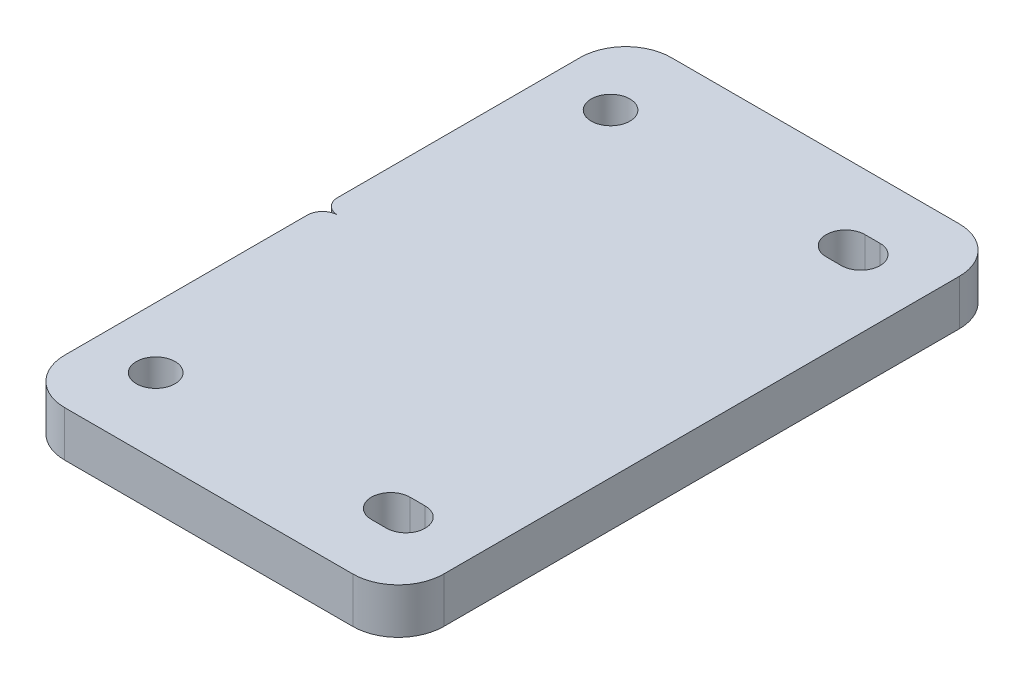
ISO-10303-21;
HEADER;
FILE_DESCRIPTION(('STEP AP214'),'2;1');
FILE_NAME('part.step','',(''),(''),'','','');
FILE_SCHEMA(('AUTOMOTIVE_DESIGN { 1 0 10303 214 1 1 1 1 }'));
ENDSEC;
DATA;
#1=APPLICATION_CONTEXT('core data for automotive mechanical design processes');
#2=APPLICATION_PROTOCOL_DEFINITION('international standard','automotive_design',2000,#1);
#3=PRODUCT_CONTEXT('',#1,'mechanical');
#4=PRODUCT('Part','Part','',(#3));
#5=PRODUCT_RELATED_PRODUCT_CATEGORY('part','',(#4));
#6=PRODUCT_DEFINITION_FORMATION('','',#4);
#7=PRODUCT_DEFINITION_CONTEXT('part definition',#1,'design');
#8=PRODUCT_DEFINITION('design','',#6,#7);
#9=PRODUCT_DEFINITION_SHAPE('','',#8);
#10=(LENGTH_UNIT() NAMED_UNIT(*) SI_UNIT(.MILLI.,.METRE.));
#11=(NAMED_UNIT(*) PLANE_ANGLE_UNIT() SI_UNIT($,.RADIAN.));
#12=(NAMED_UNIT(*) SI_UNIT($,.STERADIAN.) SOLID_ANGLE_UNIT());
#13=UNCERTAINTY_MEASURE_WITH_UNIT(LENGTH_MEASURE(1.E-05),#10,'distance_accuracy_value','');
#14=(GEOMETRIC_REPRESENTATION_CONTEXT(3) GLOBAL_UNCERTAINTY_ASSIGNED_CONTEXT((#13)) GLOBAL_UNIT_ASSIGNED_CONTEXT((#10,
#11,#12)) REPRESENTATION_CONTEXT('',''));
#15=CARTESIAN_POINT('',(0.,0.,0.));
#16=DIRECTION('',(0.,0.,1.));
#17=DIRECTION('',(1.,0.,0.));
#18=AXIS2_PLACEMENT_3D('',#15,#16,#17);
#19=CARTESIAN_POINT('',(-25.,6.,34.));
#20=DIRECTION('',(1.,0.,0.));
#21=DIRECTION('',(0.,0.,-1.));
#22=AXIS2_PLACEMENT_3D('',#19,#20,#21);
#23=PLANE('',#22);
#24=DIRECTION('',(0.,-1.,0.));
#25=VECTOR('',#24,1.);
#26=CARTESIAN_POINT('',(-25.,6.,2.));
#27=LINE('',#26,#25);
#28=CARTESIAN_POINT('',(-25.,6.,2.));
#29=VERTEX_POINT('',#28);
#30=CARTESIAN_POINT('',(-25.,0.,2.));
#31=VERTEX_POINT('',#30);
#32=EDGE_CURVE('E165',#29,#31,#27,.T.);
#33=ORIENTED_EDGE('',*,*,#32,.T.);
#34=DIRECTION('',(0.,0.,1.));
#35=VECTOR('',#34,1.);
#36=CARTESIAN_POINT('',(-25.,0.,34.));
#37=LINE('',#36,#35);
#38=CARTESIAN_POINT('',(-25.,0.,34.));
#39=VERTEX_POINT('',#38);
#40=EDGE_CURVE('E211',#31,#39,#37,.T.);
#41=ORIENTED_EDGE('',*,*,#40,.T.);
#42=DIRECTION('',(0.,-1.,0.));
#43=VECTOR('',#42,1.);
#44=CARTESIAN_POINT('',(-25.,6.,34.));
#45=LINE('',#44,#43);
#46=CARTESIAN_POINT('',(-25.,6.,34.));
#47=VERTEX_POINT('',#46);
#48=EDGE_CURVE('E185',#47,#39,#45,.T.);
#49=ORIENTED_EDGE('',*,*,#48,.F.);
#50=DIRECTION('',(0.,0.,1.));
#51=VECTOR('',#50,1.);
#52=CARTESIAN_POINT('',(-25.,6.,34.));
#53=LINE('',#52,#51);
#54=EDGE_CURVE('E179',#29,#47,#53,.T.);
#55=ORIENTED_EDGE('',*,*,#54,.F.);
#56=EDGE_LOOP('',(#33,#41,#49,#55));
#57=FACE_BOUND('',#56,.T.);
#58=ADVANCED_FACE('F33',(#57),#23,.F.);
#59=CARTESIAN_POINT('',(19.,6.,-34.));
#60=DIRECTION('',(0.,-1.,0.));
#61=DIRECTION('',(0.,0.,-1.));
#62=AXIS2_PLACEMENT_3D('',#59,#60,#61);
#63=CYLINDRICAL_SURFACE('',#62,6.);
#64=CARTESIAN_POINT('',(19.,0.,-34.));
#65=DIRECTION('',(0.,1.,0.));
#66=DIRECTION('',(0.,0.,-1.));
#67=AXIS2_PLACEMENT_3D('',#64,#65,#66);
#68=CIRCLE('',#67,6.);
#69=CARTESIAN_POINT('',(25.,0.,-34.));
#70=VERTEX_POINT('',#69);
#71=CARTESIAN_POINT('',(19.,0.,-40.));
#72=VERTEX_POINT('',#71);
#73=EDGE_CURVE('E203',#70,#72,#68,.T.);
#74=ORIENTED_EDGE('',*,*,#73,.T.);
#75=DIRECTION('',(0.,-1.,0.));
#76=VECTOR('',#75,1.);
#77=CARTESIAN_POINT('',(19.,6.,-40.));
#78=LINE('',#77,#76);
#79=CARTESIAN_POINT('',(19.,6.,-40.));
#80=VERTEX_POINT('',#79);
#81=EDGE_CURVE('E11',#80,#72,#78,.T.);
#82=ORIENTED_EDGE('',*,*,#81,.F.);
#83=CARTESIAN_POINT('',(19.,6.,-34.));
#84=DIRECTION('',(0.,1.,0.));
#85=DIRECTION('',(0.,0.,-1.));
#86=AXIS2_PLACEMENT_3D('',#83,#84,#85);
#87=CIRCLE('',#86,6.);
#88=CARTESIAN_POINT('',(25.,6.,-34.));
#89=VERTEX_POINT('',#88);
#90=EDGE_CURVE('E223',#89,#80,#87,.T.);
#91=ORIENTED_EDGE('',*,*,#90,.F.);
#92=DIRECTION('',(0.,-1.,0.));
#93=VECTOR('',#92,1.);
#94=CARTESIAN_POINT('',(25.,6.,-34.));
#95=LINE('',#94,#93);
#96=EDGE_CURVE('E202',#89,#70,#95,.T.);
#97=ORIENTED_EDGE('',*,*,#96,.T.);
#98=EDGE_LOOP('',(#74,#82,#91,#97));
#99=FACE_BOUND('',#98,.T.);
#100=ADVANCED_FACE('F35',(#99),#63,.T.);
#101=CARTESIAN_POINT('',(-19.,6.,-40.));
#102=DIRECTION('',(0.,0.,1.));
#103=DIRECTION('',(1.,0.,0.));
#104=AXIS2_PLACEMENT_3D('',#101,#102,#103);
#105=PLANE('',#104);
#106=DIRECTION('',(-1.,0.,0.));
#107=VECTOR('',#106,1.);
#108=CARTESIAN_POINT('',(-19.,0.,-40.));
#109=LINE('',#108,#107);
#110=CARTESIAN_POINT('',(-19.,0.,-40.));
#111=VERTEX_POINT('',#110);
#112=EDGE_CURVE('E206',#72,#111,#109,.T.);
#113=ORIENTED_EDGE('',*,*,#112,.T.);
#114=DIRECTION('',(0.,-1.,0.));
#115=VECTOR('',#114,1.);
#116=CARTESIAN_POINT('',(-19.,6.,-40.));
#117=LINE('',#116,#115);
#118=CARTESIAN_POINT('',(-19.,6.,-40.));
#119=VERTEX_POINT('',#118);
#120=EDGE_CURVE('E41',#119,#111,#117,.T.);
#121=ORIENTED_EDGE('',*,*,#120,.F.);
#122=DIRECTION('',(-1.,0.,0.));
#123=VECTOR('',#122,1.);
#124=CARTESIAN_POINT('',(-19.,6.,-40.));
#125=LINE('',#124,#123);
#126=EDGE_CURVE('E191',#80,#119,#125,.T.);
#127=ORIENTED_EDGE('',*,*,#126,.F.);
#128=ORIENTED_EDGE('',*,*,#81,.T.);
#129=EDGE_LOOP('',(#113,#121,#127,#128));
#130=FACE_BOUND('',#129,.T.);
#131=ADVANCED_FACE('F358',(#130),#105,.F.);
#132=CARTESIAN_POINT('',(-19.,6.,-34.));
#133=DIRECTION('',(0.,-1.,0.));
#134=DIRECTION('',(0.,0.,-1.));
#135=AXIS2_PLACEMENT_3D('',#132,#133,#134);
#136=CYLINDRICAL_SURFACE('',#135,6.);
#137=CARTESIAN_POINT('',(-19.,0.,-34.));
#138=DIRECTION('',(0.,1.,0.));
#139=DIRECTION('',(0.,0.,-1.));
#140=AXIS2_PLACEMENT_3D('',#137,#138,#139);
#141=CIRCLE('',#140,6.);
#142=CARTESIAN_POINT('',(-25.,0.,-34.));
#143=VERTEX_POINT('',#142);
#144=EDGE_CURVE('E209',#111,#143,#141,.T.);
#145=ORIENTED_EDGE('',*,*,#144,.T.);
#146=DIRECTION('',(0.,-1.,0.));
#147=VECTOR('',#146,1.);
#148=CARTESIAN_POINT('',(-25.,6.,-34.));
#149=LINE('',#148,#147);
#150=CARTESIAN_POINT('',(-25.,6.,-34.));
#151=VERTEX_POINT('',#150);
#152=EDGE_CURVE('E236',#151,#143,#149,.T.);
#153=ORIENTED_EDGE('',*,*,#152,.F.);
#154=CARTESIAN_POINT('',(-19.,6.,-34.));
#155=DIRECTION('',(0.,1.,0.));
#156=DIRECTION('',(0.,0.,-1.));
#157=AXIS2_PLACEMENT_3D('',#154,#155,#156);
#158=CIRCLE('',#157,6.);
#159=EDGE_CURVE('E188',#119,#151,#158,.T.);
#160=ORIENTED_EDGE('',*,*,#159,.F.);
#161=ORIENTED_EDGE('',*,*,#120,.T.);
#162=EDGE_LOOP('',(#145,#153,#160,#161));
#163=FACE_BOUND('',#162,.T.);
#164=ADVANCED_FACE('F243',(#163),#136,.T.);
#165=CARTESIAN_POINT('',(-25.,0.,-1.99999999999999));
#166=VERTEX_POINT('',#165);
#167=EDGE_CURVE('E212',#143,#166,#37,.T.);
#168=ORIENTED_EDGE('',*,*,#167,.T.);
#169=DIRECTION('',(0.,-1.,0.));
#170=VECTOR('',#169,1.);
#171=CARTESIAN_POINT('',(-25.,6.,-2.));
#172=LINE('',#171,#170);
#173=CARTESIAN_POINT('',(-25.,6.,-2.));
#174=VERTEX_POINT('',#173);
#175=EDGE_CURVE('E48',#174,#166,#172,.T.);
#176=ORIENTED_EDGE('',*,*,#175,.F.);
#177=EDGE_CURVE('E187',#151,#174,#53,.T.);
#178=ORIENTED_EDGE('',*,*,#177,.F.);
#179=ORIENTED_EDGE('',*,*,#152,.T.);
#180=EDGE_LOOP('',(#168,#176,#178,#179));
#181=FACE_BOUND('',#180,.T.);
#182=ADVANCED_FACE('F252',(#181),#23,.F.);
#183=CARTESIAN_POINT('',(-19.,6.,34.));
#184=DIRECTION('',(0.,-1.,0.));
#185=DIRECTION('',(0.,0.,-1.));
#186=AXIS2_PLACEMENT_3D('',#183,#184,#185);
#187=CYLINDRICAL_SURFACE('',#186,6.);
#188=CARTESIAN_POINT('',(-19.,0.,34.));
#189=DIRECTION('',(0.,1.,0.));
#190=DIRECTION('',(0.,0.,-1.));
#191=AXIS2_PLACEMENT_3D('',#188,#189,#190);
#192=CIRCLE('',#191,6.);
#193=CARTESIAN_POINT('',(-19.,0.,40.));
#194=VERTEX_POINT('',#193);
#195=EDGE_CURVE('E215',#39,#194,#192,.T.);
#196=ORIENTED_EDGE('',*,*,#195,.T.);
#197=DIRECTION('',(0.,-1.,0.));
#198=VECTOR('',#197,1.);
#199=CARTESIAN_POINT('',(-19.,6.,40.));
#200=LINE('',#199,#198);
#201=CARTESIAN_POINT('',(-19.,6.,40.));
#202=VERTEX_POINT('',#201);
#203=EDGE_CURVE('E232',#202,#194,#200,.T.);
#204=ORIENTED_EDGE('',*,*,#203,.F.);
#205=CARTESIAN_POINT('',(-19.,6.,34.));
#206=DIRECTION('',(0.,1.,0.));
#207=DIRECTION('',(0.,0.,-1.));
#208=AXIS2_PLACEMENT_3D('',#205,#206,#207);
#209=CIRCLE('',#208,6.);
#210=EDGE_CURVE('E190',#47,#202,#209,.T.);
#211=ORIENTED_EDGE('',*,*,#210,.F.);
#212=ORIENTED_EDGE('',*,*,#48,.T.);
#213=EDGE_LOOP('',(#196,#204,#211,#212));
#214=FACE_BOUND('',#213,.T.);
#215=ADVANCED_FACE('F341',(#214),#187,.T.);
#216=CARTESIAN_POINT('',(-19.,6.,40.));
#217=DIRECTION('',(0.,0.,-1.));
#218=DIRECTION('',(-1.,0.,0.));
#219=AXIS2_PLACEMENT_3D('',#216,#217,#218);
#220=PLANE('',#219);
#221=DIRECTION('',(1.,0.,0.));
#222=VECTOR('',#221,1.);
#223=CARTESIAN_POINT('',(-19.,0.,40.));
#224=LINE('',#223,#222);
#225=CARTESIAN_POINT('',(19.,0.,40.));
#226=VERTEX_POINT('',#225);
#227=EDGE_CURVE('E217',#194,#226,#224,.T.);
#228=ORIENTED_EDGE('',*,*,#227,.T.);
#229=DIRECTION('',(0.,-1.,0.));
#230=VECTOR('',#229,1.);
#231=CARTESIAN_POINT('',(19.,6.,40.));
#232=LINE('',#231,#230);
#233=CARTESIAN_POINT('',(19.,6.,40.));
#234=VERTEX_POINT('',#233);
#235=EDGE_CURVE('E229',#234,#226,#232,.T.);
#236=ORIENTED_EDGE('',*,*,#235,.F.);
#237=DIRECTION('',(1.,0.,0.));
#238=VECTOR('',#237,1.);
#239=CARTESIAN_POINT('',(-19.,6.,40.));
#240=LINE('',#239,#238);
#241=EDGE_CURVE('E196',#202,#234,#240,.T.);
#242=ORIENTED_EDGE('',*,*,#241,.F.);
#243=ORIENTED_EDGE('',*,*,#203,.T.);
#244=EDGE_LOOP('',(#228,#236,#242,#243));
#245=FACE_BOUND('',#244,.T.);
#246=ADVANCED_FACE('F348',(#245),#220,.F.);
#247=CARTESIAN_POINT('',(19.,6.,34.));
#248=DIRECTION('',(0.,-1.,0.));
#249=DIRECTION('',(0.,0.,-1.));
#250=AXIS2_PLACEMENT_3D('',#247,#248,#249);
#251=CYLINDRICAL_SURFACE('',#250,6.);
#252=CARTESIAN_POINT('',(19.,0.,34.));
#253=DIRECTION('',(0.,1.,0.));
#254=DIRECTION('',(0.,0.,1.));
#255=AXIS2_PLACEMENT_3D('',#252,#253,#254);
#256=CIRCLE('',#255,6.);
#257=CARTESIAN_POINT('',(25.,0.,34.));
#258=VERTEX_POINT('',#257);
#259=EDGE_CURVE('E219',#226,#258,#256,.T.);
#260=ORIENTED_EDGE('',*,*,#259,.T.);
#261=DIRECTION('',(0.,-1.,0.));
#262=VECTOR('',#261,1.);
#263=CARTESIAN_POINT('',(25.,6.,34.));
#264=LINE('',#263,#262);
#265=CARTESIAN_POINT('',(25.,6.,34.));
#266=VERTEX_POINT('',#265);
#267=EDGE_CURVE('E226',#266,#258,#264,.T.);
#268=ORIENTED_EDGE('',*,*,#267,.F.);
#269=CARTESIAN_POINT('',(19.,6.,34.));
#270=DIRECTION('',(0.,1.,0.));
#271=DIRECTION('',(0.,0.,1.));
#272=AXIS2_PLACEMENT_3D('',#269,#270,#271);
#273=CIRCLE('',#272,6.);
#274=EDGE_CURVE('E198',#234,#266,#273,.T.);
#275=ORIENTED_EDGE('',*,*,#274,.F.);
#276=ORIENTED_EDGE('',*,*,#235,.T.);
#277=EDGE_LOOP('',(#260,#268,#275,#276));
#278=FACE_BOUND('',#277,.T.);
#279=ADVANCED_FACE('F351',(#278),#251,.T.);
#280=CARTESIAN_POINT('',(25.,6.,34.));
#281=DIRECTION('',(-1.,0.,0.));
#282=DIRECTION('',(0.,0.,1.));
#283=AXIS2_PLACEMENT_3D('',#280,#281,#282);
#284=PLANE('',#283);
#285=DIRECTION('',(0.,0.,-1.));
#286=VECTOR('',#285,1.);
#287=CARTESIAN_POINT('',(25.,0.,34.));
#288=LINE('',#287,#286);
#289=EDGE_CURVE('E221',#258,#70,#288,.T.);
#290=ORIENTED_EDGE('',*,*,#289,.T.);
#291=ORIENTED_EDGE('',*,*,#96,.F.);
#292=DIRECTION('',(0.,0.,-1.));
#293=VECTOR('',#292,1.);
#294=CARTESIAN_POINT('',(25.,6.,34.));
#295=LINE('',#294,#293);
#296=EDGE_CURVE('E200',#266,#89,#295,.T.);
#297=ORIENTED_EDGE('',*,*,#296,.F.);
#298=ORIENTED_EDGE('',*,*,#267,.T.);
#299=EDGE_LOOP('',(#290,#291,#297,#298));
#300=FACE_BOUND('',#299,.T.);
#301=ADVANCED_FACE('F356',(#300),#284,.F.);
#302=CARTESIAN_POINT('',(19.,6.,-34.));
#303=DIRECTION('',(0.,-1.,0.));
#304=DIRECTION('',(0.,0.,-1.));
#305=AXIS2_PLACEMENT_3D('',#302,#303,#304);
#306=PLANE('',#305);
#307=CARTESIAN_POINT('',(-17.,6.,30.));
#308=DIRECTION('',(0.,-1.,0.));
#309=DIRECTION('',(0.,0.,1.));
#310=AXIS2_PLACEMENT_3D('',#307,#308,#309);
#311=CIRCLE('',#310,2.55);
#312=CARTESIAN_POINT('',(-17.,6.,32.55));
#313=VERTEX_POINT('',#312);
#314=EDGE_CURVE('E268',#313,#313,#311,.T.);
#315=ORIENTED_EDGE('',*,*,#314,.T.);
#316=EDGE_LOOP('',(#315));
#317=FACE_BOUND('',#316,.T.);
#318=DIRECTION('',(1.,0.,0.));
#319=VECTOR('',#318,1.);
#320=CARTESIAN_POINT('',(16.,6.,27.45));
#321=LINE('',#320,#319);
#322=CARTESIAN_POINT('',(14.,6.,27.45));
#323=VERTEX_POINT('',#322);
#324=CARTESIAN_POINT('',(16.,6.,27.45));
#325=VERTEX_POINT('',#324);
#326=EDGE_CURVE('E277',#323,#325,#321,.T.);
#327=ORIENTED_EDGE('',*,*,#326,.T.);
#328=CARTESIAN_POINT('',(16.,6.,30.));
#329=DIRECTION('',(0.,-1.,0.));
#330=DIRECTION('',(0.,0.,1.));
#331=AXIS2_PLACEMENT_3D('',#328,#329,#330);
#332=CIRCLE('',#331,2.55000000000001);
#333=CARTESIAN_POINT('',(16.,6.,32.55));
#334=VERTEX_POINT('',#333);
#335=EDGE_CURVE('E287',#325,#334,#332,.T.);
#336=ORIENTED_EDGE('',*,*,#335,.T.);
#337=DIRECTION('',(-1.,0.,0.));
#338=VECTOR('',#337,1.);
#339=CARTESIAN_POINT('',(16.,6.,32.55));
#340=LINE('',#339,#338);
#341=CARTESIAN_POINT('',(14.,6.,32.55));
#342=VERTEX_POINT('',#341);
#343=EDGE_CURVE('E298',#334,#342,#340,.T.);
#344=ORIENTED_EDGE('',*,*,#343,.T.);
#345=CARTESIAN_POINT('',(14.,6.,30.));
#346=DIRECTION('',(0.,-1.,0.));
#347=DIRECTION('',(0.,0.,1.));
#348=AXIS2_PLACEMENT_3D('',#345,#346,#347);
#349=CIRCLE('',#348,2.55000000000001);
#350=EDGE_CURVE('E56',#342,#323,#349,.T.);
#351=ORIENTED_EDGE('',*,*,#350,.T.);
#352=EDGE_LOOP('',(#327,#336,#344,#351));
#353=FACE_BOUND('',#352,.T.);
#354=DIRECTION('',(1.,0.,0.));
#355=VECTOR('',#354,1.);
#356=CARTESIAN_POINT('',(16.,6.,-32.55));
#357=LINE('',#356,#355);
#358=CARTESIAN_POINT('',(14.,6.,-32.55));
#359=VERTEX_POINT('',#358);
#360=CARTESIAN_POINT('',(16.,6.,-32.55));
#361=VERTEX_POINT('',#360);
#362=EDGE_CURVE('E307',#359,#361,#357,.T.);
#363=ORIENTED_EDGE('',*,*,#362,.T.);
#364=CARTESIAN_POINT('',(16.,6.,-30.));
#365=DIRECTION('',(0.,-1.,0.));
#366=DIRECTION('',(0.,0.,-1.));
#367=AXIS2_PLACEMENT_3D('',#364,#365,#366);
#368=CIRCLE('',#367,2.55000000000001);
#369=CARTESIAN_POINT('',(16.,6.,-27.45));
#370=VERTEX_POINT('',#369);
#371=EDGE_CURVE('E315',#361,#370,#368,.T.);
#372=ORIENTED_EDGE('',*,*,#371,.T.);
#373=DIRECTION('',(-1.,0.,0.));
#374=VECTOR('',#373,1.);
#375=CARTESIAN_POINT('',(16.,6.,-27.45));
#376=LINE('',#375,#374);
#377=CARTESIAN_POINT('',(14.,6.,-27.45));
#378=VERTEX_POINT('',#377);
#379=EDGE_CURVE('E328',#370,#378,#376,.T.);
#380=ORIENTED_EDGE('',*,*,#379,.T.);
#381=CARTESIAN_POINT('',(14.,6.,-30.));
#382=DIRECTION('',(0.,-1.,0.));
#383=DIRECTION('',(0.,0.,-1.));
#384=AXIS2_PLACEMENT_3D('',#381,#382,#383);
#385=CIRCLE('',#384,2.55000000000001);
#386=EDGE_CURVE('E325',#378,#359,#385,.T.);
#387=ORIENTED_EDGE('',*,*,#386,.T.);
#388=EDGE_LOOP('',(#363,#372,#380,#387));
#389=FACE_BOUND('',#388,.T.);
#390=CARTESIAN_POINT('',(-17.,6.,-30.));
#391=DIRECTION('',(0.,-1.,0.));
#392=DIRECTION('',(0.,0.,-1.));
#393=AXIS2_PLACEMENT_3D('',#390,#391,#392);
#394=CIRCLE('',#393,2.55);
#395=CARTESIAN_POINT('',(-17.,6.,-32.55));
#396=VERTEX_POINT('',#395);
#397=EDGE_CURVE('E207',#396,#396,#394,.T.);
#398=ORIENTED_EDGE('',*,*,#397,.T.);
#399=EDGE_LOOP('',(#398));
#400=FACE_BOUND('',#399,.T.);
#401=CARTESIAN_POINT('',(-23.,6.,-2.));
#402=DIRECTION('',(0.,1.,0.));
#403=DIRECTION('',(0.,0.,-1.));
#404=AXIS2_PLACEMENT_3D('',#401,#402,#403);
#405=CIRCLE('',#404,2.);
#406=CARTESIAN_POINT('',(-23.,6.,0.));
#407=VERTEX_POINT('',#406);
#408=EDGE_CURVE('E175',#174,#407,#405,.T.);
#409=ORIENTED_EDGE('',*,*,#408,.T.);
#410=CARTESIAN_POINT('',(-23.,6.,2.));
#411=DIRECTION('',(0.,1.,0.));
#412=DIRECTION('',(0.,0.,1.));
#413=AXIS2_PLACEMENT_3D('',#410,#411,#412);
#414=CIRCLE('',#413,2.);
#415=EDGE_CURVE('E168',#407,#29,#414,.T.);
#416=ORIENTED_EDGE('',*,*,#415,.T.);
#417=ORIENTED_EDGE('',*,*,#54,.T.);
#418=ORIENTED_EDGE('',*,*,#210,.T.);
#419=ORIENTED_EDGE('',*,*,#241,.T.);
#420=ORIENTED_EDGE('',*,*,#274,.T.);
#421=ORIENTED_EDGE('',*,*,#296,.T.);
#422=ORIENTED_EDGE('',*,*,#90,.T.);
#423=ORIENTED_EDGE('',*,*,#126,.T.);
#424=ORIENTED_EDGE('',*,*,#159,.T.);
#425=ORIENTED_EDGE('',*,*,#177,.T.);
#426=EDGE_LOOP('',(#409,#416,#417,#418,#419,#420,#421,#422,#423,#424,#425));
#427=FACE_BOUND('',#426,.T.);
#428=ADVANCED_FACE('F178',(#317,#353,#389,#400,#427),#306,.F.);
#429=CARTESIAN_POINT('',(19.,0.,-34.));
#430=DIRECTION('',(0.,-1.,0.));
#431=DIRECTION('',(0.,0.,-1.));
#432=AXIS2_PLACEMENT_3D('',#429,#430,#431);
#433=PLANE('',#432);
#434=CARTESIAN_POINT('',(-23.,0.,2.));
#435=DIRECTION('',(0.,1.,0.));
#436=DIRECTION('',(0.,0.,1.));
#437=AXIS2_PLACEMENT_3D('',#434,#435,#436);
#438=CIRCLE('',#437,2.);
#439=CARTESIAN_POINT('',(-23.,0.,0.));
#440=VERTEX_POINT('',#439);
#441=EDGE_CURVE('E171',#440,#31,#438,.T.);
#442=ORIENTED_EDGE('',*,*,#441,.F.);
#443=CARTESIAN_POINT('',(-23.,0.,-2.));
#444=DIRECTION('',(0.,1.,0.));
#445=DIRECTION('',(0.,0.,-1.));
#446=AXIS2_PLACEMENT_3D('',#443,#444,#445);
#447=CIRCLE('',#446,2.);
#448=EDGE_CURVE('E182',#166,#440,#447,.T.);
#449=ORIENTED_EDGE('',*,*,#448,.F.);
#450=ORIENTED_EDGE('',*,*,#167,.F.);
#451=ORIENTED_EDGE('',*,*,#144,.F.);
#452=ORIENTED_EDGE('',*,*,#112,.F.);
#453=ORIENTED_EDGE('',*,*,#73,.F.);
#454=ORIENTED_EDGE('',*,*,#289,.F.);
#455=ORIENTED_EDGE('',*,*,#259,.F.);
#456=ORIENTED_EDGE('',*,*,#227,.F.);
#457=ORIENTED_EDGE('',*,*,#195,.F.);
#458=ORIENTED_EDGE('',*,*,#40,.F.);
#459=EDGE_LOOP('',(#442,#449,#450,#451,#452,#453,#454,#455,#456,#457,#458));
#460=FACE_BOUND('',#459,.T.);
#461=CARTESIAN_POINT('',(-17.,0.,30.));
#462=DIRECTION('',(0.,-1.,0.));
#463=DIRECTION('',(0.,0.,1.));
#464=AXIS2_PLACEMENT_3D('',#461,#462,#463);
#465=CIRCLE('',#464,2.55);
#466=CARTESIAN_POINT('',(-17.,0.,32.55));
#467=VERTEX_POINT('',#466);
#468=EDGE_CURVE('E265',#467,#467,#465,.T.);
#469=ORIENTED_EDGE('',*,*,#468,.F.);
#470=EDGE_LOOP('',(#469));
#471=FACE_BOUND('',#470,.T.);
#472=CARTESIAN_POINT('',(16.,0.,30.));
#473=DIRECTION('',(0.,-1.,0.));
#474=DIRECTION('',(0.,0.,1.));
#475=AXIS2_PLACEMENT_3D('',#472,#473,#474);
#476=CIRCLE('',#475,2.55000000000001);
#477=CARTESIAN_POINT('',(16.,0.,27.45));
#478=VERTEX_POINT('',#477);
#479=CARTESIAN_POINT('',(16.,0.,32.55));
#480=VERTEX_POINT('',#479);
#481=EDGE_CURVE('E272',#478,#480,#476,.T.);
#482=ORIENTED_EDGE('',*,*,#481,.F.);
#483=DIRECTION('',(1.,0.,0.));
#484=VECTOR('',#483,1.);
#485=CARTESIAN_POINT('',(16.,0.,27.45));
#486=LINE('',#485,#484);
#487=CARTESIAN_POINT('',(14.,0.,27.45));
#488=VERTEX_POINT('',#487);
#489=EDGE_CURVE('E284',#488,#478,#486,.T.);
#490=ORIENTED_EDGE('',*,*,#489,.F.);
#491=CARTESIAN_POINT('',(14.,0.,30.));
#492=DIRECTION('',(0.,-1.,0.));
#493=DIRECTION('',(0.,0.,1.));
#494=AXIS2_PLACEMENT_3D('',#491,#492,#493);
#495=CIRCLE('',#494,2.55000000000001);
#496=CARTESIAN_POINT('',(14.,0.,32.55));
#497=VERTEX_POINT('',#496);
#498=EDGE_CURVE('E288',#497,#488,#495,.T.);
#499=ORIENTED_EDGE('',*,*,#498,.F.);
#500=DIRECTION('',(-1.,0.,0.));
#501=VECTOR('',#500,1.);
#502=CARTESIAN_POINT('',(16.,0.,32.55));
#503=LINE('',#502,#501);
#504=EDGE_CURVE('E291',#480,#497,#503,.T.);
#505=ORIENTED_EDGE('',*,*,#504,.F.);
#506=EDGE_LOOP('',(#482,#490,#499,#505));
#507=FACE_BOUND('',#506,.T.);
#508=CARTESIAN_POINT('',(16.,0.,-30.));
#509=DIRECTION('',(0.,-1.,0.));
#510=DIRECTION('',(0.,0.,-1.));
#511=AXIS2_PLACEMENT_3D('',#508,#509,#510);
#512=CIRCLE('',#511,2.55000000000001);
#513=CARTESIAN_POINT('',(16.,0.,-32.55));
#514=VERTEX_POINT('',#513);
#515=CARTESIAN_POINT('',(16.,0.,-27.45));
#516=VERTEX_POINT('',#515);
#517=EDGE_CURVE('E283',#514,#516,#512,.T.);
#518=ORIENTED_EDGE('',*,*,#517,.F.);
#519=DIRECTION('',(1.,0.,0.));
#520=VECTOR('',#519,1.);
#521=CARTESIAN_POINT('',(16.,0.,-32.55));
#522=LINE('',#521,#520);
#523=CARTESIAN_POINT('',(14.,0.,-32.55));
#524=VERTEX_POINT('',#523);
#525=EDGE_CURVE('E312',#524,#514,#522,.T.);
#526=ORIENTED_EDGE('',*,*,#525,.F.);
#527=CARTESIAN_POINT('',(14.,0.,-30.));
#528=DIRECTION('',(0.,-1.,0.));
#529=DIRECTION('',(0.,0.,-1.));
#530=AXIS2_PLACEMENT_3D('',#527,#528,#529);
#531=CIRCLE('',#530,2.55000000000001);
#532=CARTESIAN_POINT('',(14.,0.,-27.45));
#533=VERTEX_POINT('',#532);
#534=EDGE_CURVE('E316',#533,#524,#531,.T.);
#535=ORIENTED_EDGE('',*,*,#534,.F.);
#536=DIRECTION('',(-1.,0.,0.));
#537=VECTOR('',#536,1.);
#538=CARTESIAN_POINT('',(16.,0.,-27.45));
#539=LINE('',#538,#537);
#540=EDGE_CURVE('E319',#516,#533,#539,.T.);
#541=ORIENTED_EDGE('',*,*,#540,.F.);
#542=EDGE_LOOP('',(#518,#526,#535,#541));
#543=FACE_BOUND('',#542,.T.);
#544=CARTESIAN_POINT('',(-17.,0.,-30.));
#545=DIRECTION('',(0.,-1.,0.));
#546=DIRECTION('',(0.,0.,-1.));
#547=AXIS2_PLACEMENT_3D('',#544,#545,#546);
#548=CIRCLE('',#547,2.55);
#549=CARTESIAN_POINT('',(-17.,0.,-32.55));
#550=VERTEX_POINT('',#549);
#551=EDGE_CURVE('E259',#550,#550,#548,.T.);
#552=ORIENTED_EDGE('',*,*,#551,.F.);
#553=EDGE_LOOP('',(#552));
#554=FACE_BOUND('',#553,.T.);
#555=ADVANCED_FACE('F248',(#460,#471,#507,#543,#554),#433,.T.);
#556=CARTESIAN_POINT('',(-17.,6.,-30.));
#557=DIRECTION('',(0.,-1.,0.));
#558=DIRECTION('',(0.,0.,-1.));
#559=AXIS2_PLACEMENT_3D('',#556,#557,#558);
#560=CYLINDRICAL_SURFACE('',#559,2.55);
#561=ORIENTED_EDGE('',*,*,#397,.F.);
#562=EDGE_LOOP('',(#561));
#563=FACE_BOUND('',#562,.T.);
#564=ORIENTED_EDGE('',*,*,#551,.T.);
#565=EDGE_LOOP('',(#564));
#566=FACE_BOUND('',#565,.T.);
#567=ADVANCED_FACE('F385',(#563,#566),#560,.F.);
#568=CARTESIAN_POINT('',(16.,6.,-30.));
#569=DIRECTION('',(0.,-1.,0.));
#570=DIRECTION('',(0.,0.,-1.));
#571=AXIS2_PLACEMENT_3D('',#568,#569,#570);
#572=CYLINDRICAL_SURFACE('',#571,2.55000000000001);
#573=ORIENTED_EDGE('',*,*,#517,.T.);
#574=DIRECTION('',(0.,-1.,0.));
#575=VECTOR('',#574,1.);
#576=CARTESIAN_POINT('',(16.,6.,-27.45));
#577=LINE('',#576,#575);
#578=EDGE_CURVE('E303',#370,#516,#577,.T.);
#579=ORIENTED_EDGE('',*,*,#578,.F.);
#580=ORIENTED_EDGE('',*,*,#371,.F.);
#581=DIRECTION('',(0.,-1.,0.));
#582=VECTOR('',#581,1.);
#583=CARTESIAN_POINT('',(16.,6.,-32.55));
#584=LINE('',#583,#582);
#585=EDGE_CURVE('E262',#361,#514,#584,.T.);
#586=ORIENTED_EDGE('',*,*,#585,.T.);
#587=EDGE_LOOP('',(#573,#579,#580,#586));
#588=FACE_BOUND('',#587,.T.);
#589=ADVANCED_FACE('F391',(#588),#572,.F.);
#590=CARTESIAN_POINT('',(16.,6.,-32.55));
#591=DIRECTION('',(0.,0.,-1.));
#592=DIRECTION('',(-1.,0.,0.));
#593=AXIS2_PLACEMENT_3D('',#590,#591,#592);
#594=PLANE('',#593);
#595=ORIENTED_EDGE('',*,*,#525,.T.);
#596=ORIENTED_EDGE('',*,*,#585,.F.);
#597=ORIENTED_EDGE('',*,*,#362,.F.);
#598=DIRECTION('',(0.,-1.,0.));
#599=VECTOR('',#598,1.);
#600=CARTESIAN_POINT('',(14.,6.,-32.55));
#601=LINE('',#600,#599);
#602=EDGE_CURVE('E309',#359,#524,#601,.T.);
#603=ORIENTED_EDGE('',*,*,#602,.T.);
#604=EDGE_LOOP('',(#595,#596,#597,#603));
#605=FACE_BOUND('',#604,.T.);
#606=ADVANCED_FACE('F415',(#605),#594,.F.);
#607=CARTESIAN_POINT('',(14.,6.,-30.));
#608=DIRECTION('',(0.,-1.,0.));
#609=DIRECTION('',(0.,0.,-1.));
#610=AXIS2_PLACEMENT_3D('',#607,#608,#609);
#611=CYLINDRICAL_SURFACE('',#610,2.55000000000001);
#612=ORIENTED_EDGE('',*,*,#534,.T.);
#613=ORIENTED_EDGE('',*,*,#602,.F.);
#614=ORIENTED_EDGE('',*,*,#386,.F.);
#615=DIRECTION('',(0.,-1.,0.));
#616=VECTOR('',#615,1.);
#617=CARTESIAN_POINT('',(14.,6.,-27.45));
#618=LINE('',#617,#616);
#619=EDGE_CURVE('E306',#378,#533,#618,.T.);
#620=ORIENTED_EDGE('',*,*,#619,.T.);
#621=EDGE_LOOP('',(#612,#613,#614,#620));
#622=FACE_BOUND('',#621,.T.);
#623=ADVANCED_FACE('F419',(#622),#611,.F.);
#624=CARTESIAN_POINT('',(16.,6.,-27.45));
#625=DIRECTION('',(0.,0.,1.));
#626=DIRECTION('',(1.,0.,0.));
#627=AXIS2_PLACEMENT_3D('',#624,#625,#626);
#628=PLANE('',#627);
#629=ORIENTED_EDGE('',*,*,#540,.T.);
#630=ORIENTED_EDGE('',*,*,#619,.F.);
#631=ORIENTED_EDGE('',*,*,#379,.F.);
#632=ORIENTED_EDGE('',*,*,#578,.T.);
#633=EDGE_LOOP('',(#629,#630,#631,#632));
#634=FACE_BOUND('',#633,.T.);
#635=ADVANCED_FACE('F402',(#634),#628,.F.);
#636=CARTESIAN_POINT('',(16.,6.,30.));
#637=DIRECTION('',(0.,-1.,0.));
#638=DIRECTION('',(0.,0.,-1.));
#639=AXIS2_PLACEMENT_3D('',#636,#637,#638);
#640=CYLINDRICAL_SURFACE('',#639,2.55000000000001);
#641=ORIENTED_EDGE('',*,*,#481,.T.);
#642=DIRECTION('',(0.,-1.,0.));
#643=VECTOR('',#642,1.);
#644=CARTESIAN_POINT('',(16.,6.,32.55));
#645=LINE('',#644,#643);
#646=EDGE_CURVE('E273',#334,#480,#645,.T.);
#647=ORIENTED_EDGE('',*,*,#646,.F.);
#648=ORIENTED_EDGE('',*,*,#335,.F.);
#649=DIRECTION('',(0.,-1.,0.));
#650=VECTOR('',#649,1.);
#651=CARTESIAN_POINT('',(16.,6.,27.45));
#652=LINE('',#651,#650);
#653=EDGE_CURVE('E281',#325,#478,#652,.T.);
#654=ORIENTED_EDGE('',*,*,#653,.T.);
#655=EDGE_LOOP('',(#641,#647,#648,#654));
#656=FACE_BOUND('',#655,.T.);
#657=ADVANCED_FACE('F398',(#656),#640,.F.);
#658=CARTESIAN_POINT('',(16.,6.,27.45));
#659=DIRECTION('',(0.,0.,-1.));
#660=DIRECTION('',(-1.,0.,0.));
#661=AXIS2_PLACEMENT_3D('',#658,#659,#660);
#662=PLANE('',#661);
#663=ORIENTED_EDGE('',*,*,#489,.T.);
#664=ORIENTED_EDGE('',*,*,#653,.F.);
#665=ORIENTED_EDGE('',*,*,#326,.F.);
#666=DIRECTION('',(0.,-1.,0.));
#667=VECTOR('',#666,1.);
#668=CARTESIAN_POINT('',(14.,6.,27.45));
#669=LINE('',#668,#667);
#670=EDGE_CURVE('E279',#323,#488,#669,.T.);
#671=ORIENTED_EDGE('',*,*,#670,.T.);
#672=EDGE_LOOP('',(#663,#664,#665,#671));
#673=FACE_BOUND('',#672,.T.);
#674=ADVANCED_FACE('F401',(#673),#662,.F.);
#675=CARTESIAN_POINT('',(14.,6.,30.));
#676=DIRECTION('',(0.,-1.,0.));
#677=DIRECTION('',(0.,0.,-1.));
#678=AXIS2_PLACEMENT_3D('',#675,#676,#677);
#679=CYLINDRICAL_SURFACE('',#678,2.55000000000001);
#680=ORIENTED_EDGE('',*,*,#498,.T.);
#681=ORIENTED_EDGE('',*,*,#670,.F.);
#682=ORIENTED_EDGE('',*,*,#350,.F.);
#683=DIRECTION('',(0.,-1.,0.));
#684=VECTOR('',#683,1.);
#685=CARTESIAN_POINT('',(14.,6.,32.55));
#686=LINE('',#685,#684);
#687=EDGE_CURVE('E276',#342,#497,#686,.T.);
#688=ORIENTED_EDGE('',*,*,#687,.T.);
#689=EDGE_LOOP('',(#680,#681,#682,#688));
#690=FACE_BOUND('',#689,.T.);
#691=ADVANCED_FACE('F406',(#690),#679,.F.);
#692=CARTESIAN_POINT('',(16.,6.,32.55));
#693=DIRECTION('',(0.,0.,1.));
#694=DIRECTION('',(1.,0.,0.));
#695=AXIS2_PLACEMENT_3D('',#692,#693,#694);
#696=PLANE('',#695);
#697=ORIENTED_EDGE('',*,*,#504,.T.);
#698=ORIENTED_EDGE('',*,*,#687,.F.);
#699=ORIENTED_EDGE('',*,*,#343,.F.);
#700=ORIENTED_EDGE('',*,*,#646,.T.);
#701=EDGE_LOOP('',(#697,#698,#699,#700));
#702=FACE_BOUND('',#701,.T.);
#703=ADVANCED_FACE('F396',(#702),#696,.F.);
#704=CARTESIAN_POINT('',(-17.,6.,30.));
#705=DIRECTION('',(0.,-1.,0.));
#706=DIRECTION('',(0.,0.,-1.));
#707=AXIS2_PLACEMENT_3D('',#704,#705,#706);
#708=CYLINDRICAL_SURFACE('',#707,2.55);
#709=ORIENTED_EDGE('',*,*,#314,.F.);
#710=EDGE_LOOP('',(#709));
#711=FACE_BOUND('',#710,.T.);
#712=ORIENTED_EDGE('',*,*,#468,.T.);
#713=EDGE_LOOP('',(#712));
#714=FACE_BOUND('',#713,.T.);
#715=ADVANCED_FACE('F393',(#711,#714),#708,.F.);
#716=CARTESIAN_POINT('',(-23.,6.,2.));
#717=DIRECTION('',(0.,-1.,0.));
#718=DIRECTION('',(0.,0.,-1.));
#719=AXIS2_PLACEMENT_3D('',#716,#717,#718);
#720=CYLINDRICAL_SURFACE('',#719,2.);
#721=ORIENTED_EDGE('',*,*,#441,.T.);
#722=ORIENTED_EDGE('',*,*,#32,.F.);
#723=ORIENTED_EDGE('',*,*,#415,.F.);
#724=DIRECTION('',(0.,-1.,0.));
#725=VECTOR('',#724,1.);
#726=CARTESIAN_POINT('',(-23.,6.,0.));
#727=LINE('',#726,#725);
#728=EDGE_CURVE('E269',#407,#440,#727,.T.);
#729=ORIENTED_EDGE('',*,*,#728,.T.);
#730=EDGE_LOOP('',(#721,#722,#723,#729));
#731=FACE_BOUND('',#730,.T.);
#732=ADVANCED_FACE('F167',(#731),#720,.T.);
#733=CARTESIAN_POINT('',(-23.,6.,-2.));
#734=DIRECTION('',(0.,-1.,0.));
#735=DIRECTION('',(0.,0.,-1.));
#736=AXIS2_PLACEMENT_3D('',#733,#734,#735);
#737=CYLINDRICAL_SURFACE('',#736,2.);
#738=ORIENTED_EDGE('',*,*,#448,.T.);
#739=ORIENTED_EDGE('',*,*,#728,.F.);
#740=ORIENTED_EDGE('',*,*,#408,.F.);
#741=ORIENTED_EDGE('',*,*,#175,.T.);
#742=EDGE_LOOP('',(#738,#739,#740,#741));
#743=FACE_BOUND('',#742,.T.);
#744=ADVANCED_FACE('F337',(#743),#737,.T.);
#745=CLOSED_SHELL('',(#58,#100,#131,#164,#182,#215,#246,#279,#301,#428,#555,#567,#589,#606,#623,
#635,#657,#674,#691,#703,#715,#732,#744));
#746=MANIFOLD_SOLID_BREP('B2',#745);
#747=ADVANCED_BREP_SHAPE_REPRESENTATION('',(#18,#746),#14);
#748=SHAPE_DEFINITION_REPRESENTATION(#9,#747);
ENDSEC;
END-ISO-10303-21;
